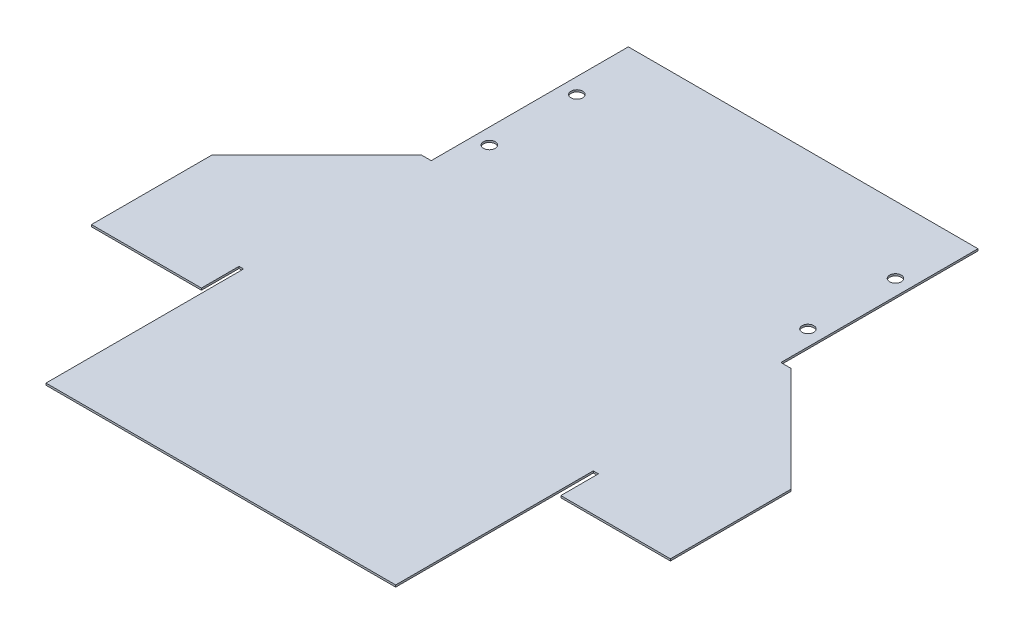
ISO-10303-21;
HEADER;
FILE_DESCRIPTION(('STEP AP214'),'2;1');
FILE_NAME('part.step','',(''),(''),'','','');
FILE_SCHEMA(('AUTOMOTIVE_DESIGN { 1 0 10303 214 1 1 1 1 }'));
ENDSEC;
DATA;
#1=APPLICATION_CONTEXT('core data for automotive mechanical design processes');
#2=APPLICATION_PROTOCOL_DEFINITION('international standard','automotive_design',2000,#1);
#3=PRODUCT_CONTEXT('',#1,'mechanical');
#4=PRODUCT('Part','Part','',(#3));
#5=PRODUCT_RELATED_PRODUCT_CATEGORY('part','',(#4));
#6=PRODUCT_DEFINITION_FORMATION('','',#4);
#7=PRODUCT_DEFINITION_CONTEXT('part definition',#1,'design');
#8=PRODUCT_DEFINITION('design','',#6,#7);
#9=PRODUCT_DEFINITION_SHAPE('','',#8);
#10=(LENGTH_UNIT() NAMED_UNIT(*) SI_UNIT(.MILLI.,.METRE.));
#11=(NAMED_UNIT(*) PLANE_ANGLE_UNIT() SI_UNIT($,.RADIAN.));
#12=(NAMED_UNIT(*) SI_UNIT($,.STERADIAN.) SOLID_ANGLE_UNIT());
#13=UNCERTAINTY_MEASURE_WITH_UNIT(LENGTH_MEASURE(1.E-05),#10,'distance_accuracy_value','');
#14=(GEOMETRIC_REPRESENTATION_CONTEXT(3) GLOBAL_UNCERTAINTY_ASSIGNED_CONTEXT((#13)) GLOBAL_UNIT_ASSIGNED_CONTEXT((#10,
#11,#12)) REPRESENTATION_CONTEXT('',''));
#15=CARTESIAN_POINT('',(0.,0.,0.));
#16=DIRECTION('',(0.,0.,1.));
#17=DIRECTION('',(1.,0.,0.));
#18=AXIS2_PLACEMENT_3D('',#15,#16,#17);
#19=CARTESIAN_POINT('',(0.,-0.500000000000087,33.4950679290022));
#20=DIRECTION('',(0.,-1.,0.));
#21=DIRECTION('',(0.,0.,-1.));
#22=AXIS2_PLACEMENT_3D('',#19,#20,#21);
#23=PLANE('',#22);
#24=DIRECTION('',(0.,0.,-1.));
#25=VECTOR('',#24,1.);
#26=CARTESIAN_POINT('',(45.,-0.499999999999993,19.6764661526356));
#27=LINE('',#26,#25);
#28=CARTESIAN_POINT('',(45.,-0.500000000000066,-30.174835060175));
#29=VERTEX_POINT('',#28);
#30=CARTESIAN_POINT('',(45.,-0.499999999999993,20.5600390864577));
#31=VERTEX_POINT('',#30);
#32=EDGE_CURVE('E314',#29,#31,#27,.F.);
#33=ORIENTED_EDGE('',*,*,#32,.T.);
#34=DIRECTION('',(1.,0.,0.));
#35=VECTOR('',#34,1.);
#36=CARTESIAN_POINT('',(45.6675884388878,-0.499999999999992,20.5600390864577));
#37=LINE('',#36,#35);
#38=CARTESIAN_POINT('',(47.6493904401487,-0.500000000000004,20.5600390864577));
#39=VERTEX_POINT('',#38);
#40=EDGE_CURVE('E440',#31,#39,#37,.T.);
#41=ORIENTED_EDGE('',*,*,#40,.T.);
#42=DIRECTION('',(-0.707106781186544,0.,-0.707106781186551));
#43=VECTOR('',#42,1.);
#44=CARTESIAN_POINT('',(60.2308658920997,-0.500000000000172,33.1415145384088));
#45=LINE('',#44,#43);
#46=CARTESIAN_POINT('',(74.5351768777756,-0.500000000000365,47.4458255240849));
#47=VERTEX_POINT('',#46);
#48=EDGE_CURVE('E419',#47,#39,#45,.T.);
#49=ORIENTED_EDGE('',*,*,#48,.F.);
#50=DIRECTION('',(0.,0.,1.));
#51=VECTOR('',#50,1.);
#52=CARTESIAN_POINT('',(74.5351768777751,-0.500000000001402,114.131029550367));
#53=LINE('',#52,#51);
#54=CARTESIAN_POINT('',(74.5351768777755,-0.500000000000916,78.5310295503674));
#55=VERTEX_POINT('',#54);
#56=EDGE_CURVE('E432',#47,#55,#53,.T.);
#57=ORIENTED_EDGE('',*,*,#56,.T.);
#58=DIRECTION('',(-1.,0.,0.));
#59=VECTOR('',#58,1.);
#60=CARTESIAN_POINT('',(59.8773125015063,-0.500000000000814,78.5310295503673));
#61=LINE('',#60,#59);
#62=CARTESIAN_POINT('',(46.3351768777755,-0.500000000000703,78.5310295503671));
#63=VERTEX_POINT('',#62);
#64=EDGE_CURVE('E430',#55,#63,#61,.T.);
#65=ORIENTED_EDGE('',*,*,#64,.T.);
#66=DIRECTION('',(0.,0.,-1.));
#67=VECTOR('',#66,1.);
#68=CARTESIAN_POINT('',(46.3351768777751,-0.500000000001208,114.131029550367));
#69=LINE('',#68,#67);
#70=CARTESIAN_POINT('',(46.3351768777756,-0.5000000000005,68.8529323052712));
#71=VERTEX_POINT('',#70);
#72=EDGE_CURVE('E429',#63,#71,#69,.T.);
#73=ORIENTED_EDGE('',*,*,#72,.T.);
#74=DIRECTION('',(1.,0.,0.));
#75=VECTOR('',#74,1.);
#76=CARTESIAN_POINT('',(45.6675884388878,-0.50000000000032,68.8529323052712));
#77=LINE('',#76,#75);
#78=CARTESIAN_POINT('',(45.,-0.50000000000032,68.8529323052712));
#79=VERTEX_POINT('',#78);
#80=EDGE_CURVE('E442',#71,#79,#77,.F.);
#81=ORIENTED_EDGE('',*,*,#80,.T.);
#82=DIRECTION('',(0.,0.,-1.));
#83=VECTOR('',#82,1.);
#84=CARTESIAN_POINT('',(45.,-0.500000000000346,69.4419809278193));
#85=LINE('',#84,#83);
#86=CARTESIAN_POINT('',(45.,-0.500000000001145,119.709126795464));
#87=VERTEX_POINT('',#86);
#88=EDGE_CURVE('E361',#79,#87,#85,.F.);
#89=ORIENTED_EDGE('',*,*,#88,.T.);
#90=DIRECTION('',(1.,0.,0.));
#91=VECTOR('',#90,1.);
#92=CARTESIAN_POINT('',(45.,-0.500000000001145,119.709126795464));
#93=LINE('',#92,#91);
#94=CARTESIAN_POINT('',(-45.,-0.500000000001159,119.709126795464));
#95=VERTEX_POINT('',#94);
#96=EDGE_CURVE('E344',#95,#87,#93,.T.);
#97=ORIENTED_EDGE('',*,*,#96,.F.);
#98=DIRECTION('',(0.,0.,-1.));
#99=VECTOR('',#98,1.);
#100=CARTESIAN_POINT('',(-45.,-0.500000000000359,69.4419809278193));
#101=LINE('',#100,#99);
#102=CARTESIAN_POINT('',(-45.,-0.500000000000353,68.8529323052712));
#103=VERTEX_POINT('',#102);
#104=EDGE_CURVE('E363',#95,#103,#101,.T.);
#105=ORIENTED_EDGE('',*,*,#104,.T.);
#106=DIRECTION('',(1.,0.,0.));
#107=VECTOR('',#106,1.);
#108=CARTESIAN_POINT('',(-45.5890486225481,-0.500000000000339,68.8529323052712));
#109=LINE('',#108,#107);
#110=CARTESIAN_POINT('',(-46.1780972450961,-0.500000000000339,68.8529323052712));
#111=VERTEX_POINT('',#110);
#112=EDGE_CURVE('E405',#103,#111,#109,.F.);
#113=ORIENTED_EDGE('',*,*,#112,.T.);
#114=DIRECTION('',(0.,0.,1.));
#115=VECTOR('',#114,1.);
#116=CARTESIAN_POINT('',(-46.1780972450956,-0.500000000000979,114.031029550367));
#117=LINE('',#116,#115);
#118=CARTESIAN_POINT('',(-46.1780972450961,-0.500000000000479,78.5310295503673));
#119=VERTEX_POINT('',#118);
#120=EDGE_CURVE('E378',#111,#119,#117,.T.);
#121=ORIENTED_EDGE('',*,*,#120,.T.);
#122=DIRECTION('',(-1.,0.,0.));
#123=VECTOR('',#122,1.);
#124=CARTESIAN_POINT('',(-59.8202328688269,-0.500000000000582,78.5310295503675));
#125=LINE('',#124,#123);
#126=CARTESIAN_POINT('',(-74.478097245096,-0.500000000000687,78.5310295503676));
#127=VERTEX_POINT('',#126);
#128=EDGE_CURVE('E375',#119,#127,#125,.T.);
#129=ORIENTED_EDGE('',*,*,#128,.T.);
#130=DIRECTION('',(0.,0.,1.));
#131=VECTOR('',#130,1.);
#132=CARTESIAN_POINT('',(-74.4780972450962,-0.500000000000535,68.8529323052713));
#133=LINE('',#132,#131);
#134=CARTESIAN_POINT('',(-74.4780972450962,-0.500000000000382,47.4458255240851));
#135=VERTEX_POINT('',#134);
#136=EDGE_CURVE('E385',#135,#127,#133,.T.);
#137=ORIENTED_EDGE('',*,*,#136,.F.);
#138=DIRECTION('',(0.707106781186543,0.,-0.707106781186552));
#139=VECTOR('',#138,1.);
#140=CARTESIAN_POINT('',(-60.1737862594203,-0.500000000000188,33.141514538409));
#141=LINE('',#140,#139);
#142=CARTESIAN_POINT('',(-47.5923108074692,-0.500000000000006,20.5600390864578));
#143=VERTEX_POINT('',#142);
#144=EDGE_CURVE('E379',#143,#135,#141,.F.);
#145=ORIENTED_EDGE('',*,*,#144,.F.);
#146=DIRECTION('',(1.,0.,0.));
#147=VECTOR('',#146,1.);
#148=CARTESIAN_POINT('',(-45.5890486225481,-0.500000000000006,20.5600390864577));
#149=LINE('',#148,#147);
#150=CARTESIAN_POINT('',(-45.,-0.500000000000006,20.5600390864577));
#151=VERTEX_POINT('',#150);
#152=EDGE_CURVE('E402',#143,#151,#149,.T.);
#153=ORIENTED_EDGE('',*,*,#152,.T.);
#154=DIRECTION('',(0.,0.,-1.));
#155=VECTOR('',#154,1.);
#156=CARTESIAN_POINT('',(-45.,-0.499999999999993,19.6764661526356));
#157=LINE('',#156,#155);
#158=CARTESIAN_POINT('',(-45.,-0.500000000000066,-30.174835060175));
#159=VERTEX_POINT('',#158);
#160=EDGE_CURVE('E321',#151,#159,#157,.T.);
#161=ORIENTED_EDGE('',*,*,#160,.T.);
#162=DIRECTION('',(1.,0.,0.));
#163=VECTOR('',#162,1.);
#164=CARTESIAN_POINT('',(45.,-0.500000000000066,-30.174835060175));
#165=LINE('',#164,#163);
#166=EDGE_CURVE('E325',#159,#29,#165,.T.);
#167=ORIENTED_EDGE('',*,*,#166,.T.);
#168=EDGE_LOOP('',(#33,#41,#49,#57,#65,#73,#81,#89,#97,#105,#113,#121,#129,#137,#145,#153,#161,#167));
#169=FACE_BOUND('',#168,.T.);
#170=CARTESIAN_POINT('',(41.,-0.5,-12.9276695296638));
#171=DIRECTION('',(0.,-1.,0.));
#172=DIRECTION('',(0.,0.,1.));
#173=AXIS2_PLACEMENT_3D('',#170,#171,#172);
#174=CIRCLE('',#173,1.5);
#175=CARTESIAN_POINT('',(41.,-0.5,-11.4276695296638));
#176=VERTEX_POINT('',#175);
#177=EDGE_CURVE('E347',#176,#176,#174,.T.);
#178=ORIENTED_EDGE('',*,*,#177,.F.);
#179=EDGE_LOOP('',(#178));
#180=FACE_BOUND('',#179,.T.);
#181=CARTESIAN_POINT('',(-41.,-0.5,-12.9276695296638));
#182=DIRECTION('',(0.,-1.,0.));
#183=DIRECTION('',(0.,0.,-1.));
#184=AXIS2_PLACEMENT_3D('',#181,#182,#183);
#185=CIRCLE('',#184,1.5);
#186=CARTESIAN_POINT('',(-41.,-0.5,-14.4276695296638));
#187=VERTEX_POINT('',#186);
#188=EDGE_CURVE('E965',#187,#187,#185,.T.);
#189=ORIENTED_EDGE('',*,*,#188,.F.);
#190=EDGE_LOOP('',(#189));
#191=FACE_BOUND('',#190,.T.);
#192=CARTESIAN_POINT('',(41.,-0.5,9.59193788096968));
#193=DIRECTION('',(0.,-1.,0.));
#194=DIRECTION('',(0.,0.,1.));
#195=AXIS2_PLACEMENT_3D('',#192,#193,#194);
#196=CIRCLE('',#195,1.5);
#197=CARTESIAN_POINT('',(41.,-0.5,11.0919378809697));
#198=VERTEX_POINT('',#197);
#199=EDGE_CURVE('E973',#198,#198,#196,.T.);
#200=ORIENTED_EDGE('',*,*,#199,.F.);
#201=EDGE_LOOP('',(#200));
#202=FACE_BOUND('',#201,.T.);
#203=CARTESIAN_POINT('',(-41.,-0.5,9.59193788096968));
#204=DIRECTION('',(0.,-1.,0.));
#205=DIRECTION('',(0.,0.,-1.));
#206=AXIS2_PLACEMENT_3D('',#203,#204,#205);
#207=CIRCLE('',#206,1.5);
#208=CARTESIAN_POINT('',(-41.,-0.5,8.09193788096968));
#209=VERTEX_POINT('',#208);
#210=EDGE_CURVE('E979',#209,#209,#207,.T.);
#211=ORIENTED_EDGE('',*,*,#210,.F.);
#212=EDGE_LOOP('',(#211));
#213=FACE_BOUND('',#212,.T.);
#214=ADVANCED_FACE('F186',(#169,#180,#191,#202,#213),#23,.T.);
#215=CARTESIAN_POINT('',(0.,0.,0.));
#216=DIRECTION('',(0.,1.,0.));
#217=DIRECTION('',(0.,0.,1.));
#218=AXIS2_PLACEMENT_3D('',#215,#216,#217);
#219=PLANE('',#218);
#220=DIRECTION('',(0.,0.,-1.));
#221=VECTOR('',#220,1.);
#222=CARTESIAN_POINT('',(-45.,0.,19.6764661526356));
#223=LINE('',#222,#221);
#224=CARTESIAN_POINT('',(-45.,0.,20.5600390864577));
#225=VERTEX_POINT('',#224);
#226=CARTESIAN_POINT('',(-45.,0.,-30.174835060175));
#227=VERTEX_POINT('',#226);
#228=EDGE_CURVE('E322',#225,#227,#223,.T.);
#229=ORIENTED_EDGE('',*,*,#228,.F.);
#230=DIRECTION('',(1.,0.,0.));
#231=VECTOR('',#230,1.);
#232=CARTESIAN_POINT('',(-45.5890486225481,0.,20.5600390864577));
#233=LINE('',#232,#231);
#234=CARTESIAN_POINT('',(-47.5923108074692,0.,20.5600390864578));
#235=VERTEX_POINT('',#234);
#236=EDGE_CURVE('E211',#235,#225,#233,.T.);
#237=ORIENTED_EDGE('',*,*,#236,.F.);
#238=DIRECTION('',(-0.707106781186543,0.,0.707106781186552));
#239=VECTOR('',#238,1.);
#240=CARTESIAN_POINT('',(-60.1737862594203,-1.89084858881472E-13,33.141514538409));
#241=LINE('',#240,#239);
#242=CARTESIAN_POINT('',(-74.4780972450962,-3.90312782094782E-13,47.4458255240851));
#243=VERTEX_POINT('',#242);
#244=EDGE_CURVE('E371',#235,#243,#241,.T.);
#245=ORIENTED_EDGE('',*,*,#244,.T.);
#246=DIRECTION('',(0.,0.,1.));
#247=VECTOR('',#246,1.);
#248=CARTESIAN_POINT('',(-74.4780972450962,-5.39499001028787E-13,68.5310295503676));
#249=LINE('',#248,#247);
#250=CARTESIAN_POINT('',(-74.4780972450961,-6.78276879106932E-13,78.5310295503676));
#251=VERTEX_POINT('',#250);
#252=EDGE_CURVE('E395',#251,#243,#249,.F.);
#253=ORIENTED_EDGE('',*,*,#252,.F.);
#254=DIRECTION('',(1.,0.,0.));
#255=VECTOR('',#254,1.);
#256=CARTESIAN_POINT('',(-74.478097245096,-6.78276879106932E-13,78.5310295503676));
#257=LINE('',#256,#255);
#258=CARTESIAN_POINT('',(-46.1780972450961,-4.66640615037761E-13,78.5310295503673));
#259=VERTEX_POINT('',#258);
#260=EDGE_CURVE('E393',#259,#251,#257,.F.);
#261=ORIENTED_EDGE('',*,*,#260,.F.);
#262=DIRECTION('',(0.,0.,-1.));
#263=VECTOR('',#262,1.);
#264=CARTESIAN_POINT('',(-46.1780972450961,-4.77048955893622E-13,78.5310295503673));
#265=LINE('',#264,#263);
#266=CARTESIAN_POINT('',(-46.1780972450962,-1.85615411929518E-13,68.8529323052713));
#267=VERTEX_POINT('',#266);
#268=EDGE_CURVE('E381',#267,#259,#265,.F.);
#269=ORIENTED_EDGE('',*,*,#268,.F.);
#270=DIRECTION('',(1.,0.,0.));
#271=VECTOR('',#270,1.);
#272=CARTESIAN_POINT('',(-45.5890486225481,-3.43475248243408E-13,68.8529323052712));
#273=LINE('',#272,#271);
#274=CARTESIAN_POINT('',(-45.,-3.53883589099269E-13,68.8529323052712));
#275=VERTEX_POINT('',#274);
#276=EDGE_CURVE('E374',#275,#267,#273,.F.);
#277=ORIENTED_EDGE('',*,*,#276,.F.);
#278=DIRECTION('',(0.,0.,-1.));
#279=VECTOR('',#278,1.);
#280=CARTESIAN_POINT('',(-45.,-3.60822483003176E-13,69.4419809278193));
#281=LINE('',#280,#279);
#282=CARTESIAN_POINT('',(-45.,-1.17267306976032E-12,119.709126795464));
#283=VERTEX_POINT('',#282);
#284=EDGE_CURVE('E364',#283,#275,#281,.T.);
#285=ORIENTED_EDGE('',*,*,#284,.F.);
#286=DIRECTION('',(1.,0.,0.));
#287=VECTOR('',#286,1.);
#288=CARTESIAN_POINT('',(45.,-1.15879528195251E-12,119.709126795464));
#289=LINE('',#288,#287);
#290=CARTESIAN_POINT('',(45.,-1.15879528195251E-12,119.709126795464));
#291=VERTEX_POINT('',#290);
#292=EDGE_CURVE('E349',#283,#291,#289,.T.);
#293=ORIENTED_EDGE('',*,*,#292,.T.);
#294=DIRECTION('',(0.,0.,-1.));
#295=VECTOR('',#294,1.);
#296=CARTESIAN_POINT('',(45.,-3.46944695195361E-13,69.4419809278193));
#297=LINE('',#296,#295);
#298=CARTESIAN_POINT('',(45.,-3.40005801291454E-13,68.8529323052712));
#299=VERTEX_POINT('',#298);
#300=EDGE_CURVE('E352',#299,#291,#297,.F.);
#301=ORIENTED_EDGE('',*,*,#300,.F.);
#302=DIRECTION('',(1.,0.,0.));
#303=VECTOR('',#302,1.);
#304=CARTESIAN_POINT('',(45.6675884388878,-3.22658566531686E-13,68.8529323052712));
#305=LINE('',#304,#303);
#306=CARTESIAN_POINT('',(46.3351768777757,-3.3133218391157E-13,68.8529323052712));
#307=VERTEX_POINT('',#306);
#308=EDGE_CURVE('E443',#307,#299,#305,.F.);
#309=ORIENTED_EDGE('',*,*,#308,.F.);
#310=DIRECTION('',(0.,0.,1.));
#311=VECTOR('',#310,1.);
#312=CARTESIAN_POINT('',(46.3351768777756,-5.77662917500277E-13,68.5310295503671));
#313=LINE('',#312,#311);
#314=CARTESIAN_POINT('',(46.3351768777755,-7.14706072102445E-13,78.5310295503671));
#315=VERTEX_POINT('',#314);
#316=EDGE_CURVE('E425',#315,#307,#313,.F.);
#317=ORIENTED_EDGE('',*,*,#316,.F.);
#318=DIRECTION('',(1.,0.,0.));
#319=VECTOR('',#318,1.);
#320=CARTESIAN_POINT('',(46.3351768777755,-7.14706072102445E-13,78.5310295503671));
#321=LINE('',#320,#319);
#322=CARTESIAN_POINT('',(74.5351768777755,-9.10729824887824E-13,78.5310295503675));
#323=VERTEX_POINT('',#322);
#324=EDGE_CURVE('E404',#323,#315,#321,.F.);
#325=ORIENTED_EDGE('',*,*,#324,.F.);
#326=DIRECTION('',(0.,0.,-1.));
#327=VECTOR('',#326,1.);
#328=CARTESIAN_POINT('',(74.5351768777755,-9.08995101411847E-13,78.5310295503675));
#329=LINE('',#328,#327);
#330=CARTESIAN_POINT('',(74.5351768777756,-3.67761376907083E-13,47.4458255240849));
#331=VERTEX_POINT('',#330);
#332=EDGE_CURVE('E434',#331,#323,#329,.F.);
#333=ORIENTED_EDGE('',*,*,#332,.F.);
#334=DIRECTION('',(-0.707106781186544,0.,-0.707106781186551));
#335=VECTOR('',#334,1.);
#336=CARTESIAN_POINT('',(60.2308658920997,-1.73472347597681E-13,33.1415145384088));
#337=LINE('',#336,#335);
#338=CARTESIAN_POINT('',(47.6493904401487,0.,20.5600390864577));
#339=VERTEX_POINT('',#338);
#340=EDGE_CURVE('E412',#331,#339,#337,.T.);
#341=ORIENTED_EDGE('',*,*,#340,.T.);
#342=DIRECTION('',(1.,0.,0.));
#343=VECTOR('',#342,1.);
#344=CARTESIAN_POINT('',(45.6675884388878,0.,20.5600390864577));
#345=LINE('',#344,#343);
#346=CARTESIAN_POINT('',(45.,0.,20.5600390864577));
#347=VERTEX_POINT('',#346);
#348=EDGE_CURVE('E203',#347,#339,#345,.T.);
#349=ORIENTED_EDGE('',*,*,#348,.F.);
#350=DIRECTION('',(0.,0.,-1.));
#351=VECTOR('',#350,1.);
#352=CARTESIAN_POINT('',(45.,0.,19.6764661526356));
#353=LINE('',#352,#351);
#354=CARTESIAN_POINT('',(45.,0.,-30.174835060175));
#355=VERTEX_POINT('',#354);
#356=EDGE_CURVE('E345',#355,#347,#353,.F.);
#357=ORIENTED_EDGE('',*,*,#356,.F.);
#358=DIRECTION('',(1.,0.,0.));
#359=VECTOR('',#358,1.);
#360=CARTESIAN_POINT('',(45.,0.,-30.174835060175));
#361=LINE('',#360,#359);
#362=EDGE_CURVE('E336',#227,#355,#361,.T.);
#363=ORIENTED_EDGE('',*,*,#362,.F.);
#364=EDGE_LOOP('',(#229,#237,#245,#253,#261,#269,#277,#285,#293,#301,#309,#317,#325,#333,#341,
#349,#357,#363));
#365=FACE_BOUND('',#364,.T.);
#366=CARTESIAN_POINT('',(41.,0.,-12.9276695296638));
#367=DIRECTION('',(0.,1.,0.));
#368=DIRECTION('',(0.,0.,1.));
#369=AXIS2_PLACEMENT_3D('',#366,#367,#368);
#370=CIRCLE('',#369,1.5);
#371=CARTESIAN_POINT('',(41.,0.,-11.4276695296638));
#372=VERTEX_POINT('',#371);
#373=EDGE_CURVE('E961',#372,#372,#370,.T.);
#374=ORIENTED_EDGE('',*,*,#373,.F.);
#375=EDGE_LOOP('',(#374));
#376=FACE_BOUND('',#375,.T.);
#377=CARTESIAN_POINT('',(-41.,0.,-12.9276695296638));
#378=DIRECTION('',(0.,1.,0.));
#379=DIRECTION('',(0.,0.,1.));
#380=AXIS2_PLACEMENT_3D('',#377,#378,#379);
#381=CIRCLE('',#380,1.5);
#382=CARTESIAN_POINT('',(-41.,0.,-11.4276695296638));
#383=VERTEX_POINT('',#382);
#384=EDGE_CURVE('E970',#383,#383,#381,.T.);
#385=ORIENTED_EDGE('',*,*,#384,.F.);
#386=EDGE_LOOP('',(#385));
#387=FACE_BOUND('',#386,.T.);
#388=CARTESIAN_POINT('',(41.,0.,9.59193788096968));
#389=DIRECTION('',(0.,1.,0.));
#390=DIRECTION('',(0.,0.,1.));
#391=AXIS2_PLACEMENT_3D('',#388,#389,#390);
#392=CIRCLE('',#391,1.5);
#393=CARTESIAN_POINT('',(41.,0.,11.0919378809697));
#394=VERTEX_POINT('',#393);
#395=EDGE_CURVE('E976',#394,#394,#392,.T.);
#396=ORIENTED_EDGE('',*,*,#395,.F.);
#397=EDGE_LOOP('',(#396));
#398=FACE_BOUND('',#397,.T.);
#399=CARTESIAN_POINT('',(-41.,0.,9.59193788096968));
#400=DIRECTION('',(0.,1.,0.));
#401=DIRECTION('',(0.,0.,1.));
#402=AXIS2_PLACEMENT_3D('',#399,#400,#401);
#403=CIRCLE('',#402,1.5);
#404=CARTESIAN_POINT('',(-41.,0.,11.0919378809697));
#405=VERTEX_POINT('',#404);
#406=EDGE_CURVE('E331',#405,#405,#403,.T.);
#407=ORIENTED_EDGE('',*,*,#406,.F.);
#408=EDGE_LOOP('',(#407));
#409=FACE_BOUND('',#408,.T.);
#410=ADVANCED_FACE('F188',(#365,#376,#387,#398,#409),#219,.T.);
#411=CARTESIAN_POINT('',(45.6675884388878,-0.249999999999993,20.5600390864577));
#412=DIRECTION('',(0.,0.,-1.));
#413=DIRECTION('',(1.,0.,0.));
#414=AXIS2_PLACEMENT_3D('',#411,#412,#413);
#415=PLANE('',#414);
#416=DIRECTION('',(0.,-1.,0.));
#417=VECTOR('',#416,1.);
#418=CARTESIAN_POINT('',(45.,0.,20.5600390864577));
#419=LINE('',#418,#417);
#420=EDGE_CURVE('E13',#347,#31,#419,.T.);
#421=ORIENTED_EDGE('',*,*,#420,.F.);
#422=ORIENTED_EDGE('',*,*,#348,.T.);
#423=DIRECTION('',(0.,1.,0.));
#424=VECTOR('',#423,1.);
#425=CARTESIAN_POINT('',(47.6493904401487,0.,20.5600390864577));
#426=LINE('',#425,#424);
#427=EDGE_CURVE('E416',#339,#39,#426,.F.);
#428=ORIENTED_EDGE('',*,*,#427,.T.);
#429=ORIENTED_EDGE('',*,*,#40,.F.);
#430=EDGE_LOOP('',(#421,#422,#428,#429));
#431=FACE_BOUND('',#430,.T.);
#432=ADVANCED_FACE('F522',(#431),#415,.T.);
#433=CARTESIAN_POINT('',(45.6675884388878,-0.250000000000328,68.8529323052712));
#434=DIRECTION('',(0.,0.,-1.));
#435=DIRECTION('',(1.,0.,0.));
#436=AXIS2_PLACEMENT_3D('',#433,#434,#435);
#437=PLANE('',#436);
#438=ORIENTED_EDGE('',*,*,#308,.T.);
#439=DIRECTION('',(0.,-1.,0.));
#440=VECTOR('',#439,1.);
#441=CARTESIAN_POINT('',(45.,-3.40005801291454E-13,68.8529323052712));
#442=LINE('',#441,#440);
#443=EDGE_CURVE('E445',#299,#79,#442,.T.);
#444=ORIENTED_EDGE('',*,*,#443,.T.);
#445=ORIENTED_EDGE('',*,*,#80,.F.);
#446=DIRECTION('',(0.,-1.,0.));
#447=VECTOR('',#446,1.);
#448=CARTESIAN_POINT('',(46.3351768777756,-0.500000000000337,68.8529323052712));
#449=LINE('',#448,#447);
#450=EDGE_CURVE('E409',#307,#71,#449,.T.);
#451=ORIENTED_EDGE('',*,*,#450,.F.);
#452=EDGE_LOOP('',(#438,#444,#445,#451));
#453=FACE_BOUND('',#452,.T.);
#454=ADVANCED_FACE('F503',(#453),#437,.F.);
#455=CARTESIAN_POINT('',(46.3351768777755,-0.500000000000703,78.5310295503671));
#456=DIRECTION('',(0.,0.,-1.));
#457=DIRECTION('',(0.707106781186538,-0.707106781186557,0.));
#458=AXIS2_PLACEMENT_3D('',#455,#456,#457);
#459=PLANE('',#458);
#460=ORIENTED_EDGE('',*,*,#324,.T.);
#461=DIRECTION('',(0.,1.,0.));
#462=VECTOR('',#461,1.);
#463=CARTESIAN_POINT('',(46.3351768777755,-0.500000000000703,78.5310295503671));
#464=LINE('',#463,#462);
#465=EDGE_CURVE('E426',#63,#315,#464,.T.);
#466=ORIENTED_EDGE('',*,*,#465,.F.);
#467=ORIENTED_EDGE('',*,*,#64,.F.);
#468=DIRECTION('',(0.,1.,0.));
#469=VECTOR('',#468,1.);
#470=CARTESIAN_POINT('',(74.5351768777755,-0.500000000000913,78.5310295503675));
#471=LINE('',#470,#469);
#472=EDGE_CURVE('E436',#55,#323,#471,.T.);
#473=ORIENTED_EDGE('',*,*,#472,.T.);
#474=EDGE_LOOP('',(#460,#466,#467,#473));
#475=FACE_BOUND('',#474,.T.);
#476=ADVANCED_FACE('F511',(#475),#459,.F.);
#477=CARTESIAN_POINT('',(74.5351768777755,-0.500000000000911,78.5310295503675));
#478=DIRECTION('',(-1.,0.,0.));
#479=DIRECTION('',(0.,1.,0.));
#480=AXIS2_PLACEMENT_3D('',#477,#478,#479);
#481=PLANE('',#480);
#482=ORIENTED_EDGE('',*,*,#56,.F.);
#483=DIRECTION('',(0.,1.,0.));
#484=VECTOR('',#483,1.);
#485=CARTESIAN_POINT('',(74.5351768777756,-3.67761376907083E-13,47.4458255240849));
#486=LINE('',#485,#484);
#487=EDGE_CURVE('E422',#331,#47,#486,.F.);
#488=ORIENTED_EDGE('',*,*,#487,.F.);
#489=ORIENTED_EDGE('',*,*,#332,.T.);
#490=ORIENTED_EDGE('',*,*,#472,.F.);
#491=EDGE_LOOP('',(#482,#488,#489,#490));
#492=FACE_BOUND('',#491,.T.);
#493=ADVANCED_FACE('F520',(#492),#481,.F.);
#494=CARTESIAN_POINT('',(46.3351768777756,-0.50000000000058,68.5310295503671));
#495=DIRECTION('',(1.,0.,0.));
#496=DIRECTION('',(0.,-1.,0.));
#497=AXIS2_PLACEMENT_3D('',#494,#495,#496);
#498=PLANE('',#497);
#499=ORIENTED_EDGE('',*,*,#316,.T.);
#500=ORIENTED_EDGE('',*,*,#450,.T.);
#501=ORIENTED_EDGE('',*,*,#72,.F.);
#502=ORIENTED_EDGE('',*,*,#465,.T.);
#503=EDGE_LOOP('',(#499,#500,#501,#502));
#504=FACE_BOUND('',#503,.T.);
#505=ADVANCED_FACE('F507',(#504),#498,.F.);
#506=CARTESIAN_POINT('',(60.2308658920997,-1.73472347597681E-13,33.1415145384088));
#507=DIRECTION('',(-0.707106781186551,0.,0.707106781186544));
#508=DIRECTION('',(-0.707106781186544,0.,-0.707106781186551));
#509=AXIS2_PLACEMENT_3D('',#506,#507,#508);
#510=PLANE('',#509);
#511=ORIENTED_EDGE('',*,*,#427,.F.);
#512=ORIENTED_EDGE('',*,*,#340,.F.);
#513=ORIENTED_EDGE('',*,*,#487,.T.);
#514=ORIENTED_EDGE('',*,*,#48,.T.);
#515=EDGE_LOOP('',(#511,#512,#513,#514));
#516=FACE_BOUND('',#515,.T.);
#517=ADVANCED_FACE('F518',(#516),#510,.F.);
#518=CARTESIAN_POINT('',(-45.5890486225481,-0.250000000000342,68.8529323052712));
#519=DIRECTION('',(0.,0.,-1.));
#520=DIRECTION('',(1.,0.,0.));
#521=AXIS2_PLACEMENT_3D('',#518,#519,#520);
#522=PLANE('',#521);
#523=DIRECTION('',(0.,-1.,0.));
#524=VECTOR('',#523,1.);
#525=CARTESIAN_POINT('',(-45.,-3.53883589099269E-13,68.8529323052712));
#526=LINE('',#525,#524);
#527=EDGE_CURVE('E452',#275,#103,#526,.T.);
#528=ORIENTED_EDGE('',*,*,#527,.F.);
#529=ORIENTED_EDGE('',*,*,#276,.T.);
#530=DIRECTION('',(0.,-1.,0.));
#531=VECTOR('',#530,1.);
#532=CARTESIAN_POINT('',(-46.1780972450962,-3.2612801348364E-13,68.8529323052713));
#533=LINE('',#532,#531);
#534=EDGE_CURVE('E367',#267,#111,#533,.T.);
#535=ORIENTED_EDGE('',*,*,#534,.T.);
#536=ORIENTED_EDGE('',*,*,#112,.F.);
#537=EDGE_LOOP('',(#528,#529,#535,#536));
#538=FACE_BOUND('',#537,.T.);
#539=ADVANCED_FACE('F484',(#538),#522,.F.);
#540=CARTESIAN_POINT('',(-45.5890486225481,-0.250000000000005,20.5600390864577));
#541=DIRECTION('',(0.,0.,-1.));
#542=DIRECTION('',(1.,0.,0.));
#543=AXIS2_PLACEMENT_3D('',#540,#541,#542);
#544=PLANE('',#543);
#545=ORIENTED_EDGE('',*,*,#236,.T.);
#546=DIRECTION('',(0.,-1.,0.));
#547=VECTOR('',#546,1.);
#548=CARTESIAN_POINT('',(-45.,0.,20.5600390864577));
#549=LINE('',#548,#547);
#550=EDGE_CURVE('E195',#225,#151,#549,.T.);
#551=ORIENTED_EDGE('',*,*,#550,.T.);
#552=ORIENTED_EDGE('',*,*,#152,.F.);
#553=DIRECTION('',(0.,1.,0.));
#554=VECTOR('',#553,1.);
#555=CARTESIAN_POINT('',(-47.5923108074692,0.,20.5600390864578));
#556=LINE('',#555,#554);
#557=EDGE_CURVE('E382',#235,#143,#556,.F.);
#558=ORIENTED_EDGE('',*,*,#557,.F.);
#559=EDGE_LOOP('',(#545,#551,#552,#558));
#560=FACE_BOUND('',#559,.T.);
#561=ADVANCED_FACE('F525',(#560),#544,.T.);
#562=CARTESIAN_POINT('',(-74.4780972450962,-0.500000000000538,68.5310295503676));
#563=DIRECTION('',(1.,0.,0.));
#564=DIRECTION('',(0.,1.,0.));
#565=AXIS2_PLACEMENT_3D('',#562,#563,#564);
#566=PLANE('',#565);
#567=ORIENTED_EDGE('',*,*,#252,.T.);
#568=DIRECTION('',(0.,1.,0.));
#569=VECTOR('',#568,1.);
#570=CARTESIAN_POINT('',(-74.4780972450962,-3.90312782094782E-13,47.4458255240851));
#571=LINE('',#570,#569);
#572=EDGE_CURVE('E387',#243,#135,#571,.F.);
#573=ORIENTED_EDGE('',*,*,#572,.T.);
#574=ORIENTED_EDGE('',*,*,#136,.T.);
#575=DIRECTION('',(0.,1.,0.));
#576=VECTOR('',#575,1.);
#577=CARTESIAN_POINT('',(-74.478097245096,-0.500000000000687,78.5310295503676));
#578=LINE('',#577,#576);
#579=EDGE_CURVE('E397',#127,#251,#578,.T.);
#580=ORIENTED_EDGE('',*,*,#579,.T.);
#581=EDGE_LOOP('',(#567,#573,#574,#580));
#582=FACE_BOUND('',#581,.T.);
#583=ADVANCED_FACE('F477',(#582),#566,.F.);
#584=CARTESIAN_POINT('',(-74.478097245096,-0.500000000000687,78.5310295503676));
#585=DIRECTION('',(0.,0.,-1.));
#586=DIRECTION('',(-0.707106781186556,0.707106781186539,0.));
#587=AXIS2_PLACEMENT_3D('',#584,#585,#586);
#588=PLANE('',#587);
#589=ORIENTED_EDGE('',*,*,#260,.T.);
#590=ORIENTED_EDGE('',*,*,#579,.F.);
#591=ORIENTED_EDGE('',*,*,#128,.F.);
#592=DIRECTION('',(0.,1.,0.));
#593=VECTOR('',#592,1.);
#594=CARTESIAN_POINT('',(-46.178097245096,-0.500000000000474,78.5310295503673));
#595=LINE('',#594,#593);
#596=EDGE_CURVE('E390',#119,#259,#595,.T.);
#597=ORIENTED_EDGE('',*,*,#596,.T.);
#598=EDGE_LOOP('',(#589,#590,#591,#597));
#599=FACE_BOUND('',#598,.T.);
#600=ADVANCED_FACE('F469',(#599),#588,.F.);
#601=CARTESIAN_POINT('',(-60.1737862594203,-1.89084858881472E-13,33.141514538409));
#602=DIRECTION('',(0.707106781186552,0.,0.707106781186544));
#603=DIRECTION('',(-0.707106781186543,0.,0.707106781186552));
#604=AXIS2_PLACEMENT_3D('',#601,#602,#603);
#605=PLANE('',#604);
#606=ORIENTED_EDGE('',*,*,#572,.F.);
#607=ORIENTED_EDGE('',*,*,#244,.F.);
#608=ORIENTED_EDGE('',*,*,#557,.T.);
#609=ORIENTED_EDGE('',*,*,#144,.T.);
#610=EDGE_LOOP('',(#606,#607,#608,#609));
#611=FACE_BOUND('',#610,.T.);
#612=ADVANCED_FACE('F480',(#611),#605,.F.);
#613=CARTESIAN_POINT('',(-46.1780972450961,-0.500000000000472,78.5310295503673));
#614=DIRECTION('',(-1.,0.,0.));
#615=DIRECTION('',(0.,-1.,0.));
#616=AXIS2_PLACEMENT_3D('',#613,#614,#615);
#617=PLANE('',#616);
#618=ORIENTED_EDGE('',*,*,#120,.F.);
#619=ORIENTED_EDGE('',*,*,#534,.F.);
#620=ORIENTED_EDGE('',*,*,#268,.T.);
#621=ORIENTED_EDGE('',*,*,#596,.F.);
#622=EDGE_LOOP('',(#618,#619,#620,#621));
#623=FACE_BOUND('',#622,.T.);
#624=ADVANCED_FACE('F465',(#623),#617,.F.);
#625=CARTESIAN_POINT('',(45.,-0.250000000000347,69.4419809278193));
#626=DIRECTION('',(-1.,0.,0.));
#627=DIRECTION('',(0.,0.,-1.));
#628=AXIS2_PLACEMENT_3D('',#625,#626,#627);
#629=PLANE('',#628);
#630=ORIENTED_EDGE('',*,*,#443,.F.);
#631=ORIENTED_EDGE('',*,*,#300,.T.);
#632=DIRECTION('',(0.,1.,0.));
#633=VECTOR('',#632,1.);
#634=CARTESIAN_POINT('',(45.,-0.500000000001145,119.709126795464));
#635=LINE('',#634,#633);
#636=EDGE_CURVE('E356',#87,#291,#635,.T.);
#637=ORIENTED_EDGE('',*,*,#636,.F.);
#638=ORIENTED_EDGE('',*,*,#88,.F.);
#639=EDGE_LOOP('',(#630,#631,#637,#638));
#640=FACE_BOUND('',#639,.T.);
#641=ADVANCED_FACE('F497',(#640),#629,.F.);
#642=CARTESIAN_POINT('',(-45.,-0.250000000000361,69.4419809278193));
#643=DIRECTION('',(-1.,0.,0.));
#644=DIRECTION('',(0.,0.,-1.));
#645=AXIS2_PLACEMENT_3D('',#642,#643,#644);
#646=PLANE('',#645);
#647=ORIENTED_EDGE('',*,*,#284,.T.);
#648=ORIENTED_EDGE('',*,*,#527,.T.);
#649=ORIENTED_EDGE('',*,*,#104,.F.);
#650=DIRECTION('',(0.,1.,0.));
#651=VECTOR('',#650,1.);
#652=CARTESIAN_POINT('',(-45.,-0.500000000001159,119.709126795464));
#653=LINE('',#652,#651);
#654=EDGE_CURVE('E353',#95,#283,#653,.T.);
#655=ORIENTED_EDGE('',*,*,#654,.T.);
#656=EDGE_LOOP('',(#647,#648,#649,#655));
#657=FACE_BOUND('',#656,.T.);
#658=ADVANCED_FACE('F489',(#657),#646,.T.);
#659=CARTESIAN_POINT('',(45.,-0.500000000001145,119.709126795464));
#660=DIRECTION('',(0.,0.,1.));
#661=DIRECTION('',(0.,-1.,0.));
#662=AXIS2_PLACEMENT_3D('',#659,#660,#661);
#663=PLANE('',#662);
#664=ORIENTED_EDGE('',*,*,#292,.F.);
#665=ORIENTED_EDGE('',*,*,#654,.F.);
#666=ORIENTED_EDGE('',*,*,#96,.T.);
#667=ORIENTED_EDGE('',*,*,#636,.T.);
#668=EDGE_LOOP('',(#664,#665,#666,#667));
#669=FACE_BOUND('',#668,.T.);
#670=ADVANCED_FACE('F492',(#669),#663,.T.);
#671=CARTESIAN_POINT('',(45.,-0.249999999999993,19.6764661526356));
#672=DIRECTION('',(-1.,0.,0.));
#673=DIRECTION('',(0.,0.,-1.));
#674=AXIS2_PLACEMENT_3D('',#671,#672,#673);
#675=PLANE('',#674);
#676=ORIENTED_EDGE('',*,*,#32,.F.);
#677=DIRECTION('',(0.,1.,0.));
#678=VECTOR('',#677,1.);
#679=CARTESIAN_POINT('',(45.,-0.500000000000066,-30.174835060175));
#680=LINE('',#679,#678);
#681=EDGE_CURVE('E319',#29,#355,#680,.T.);
#682=ORIENTED_EDGE('',*,*,#681,.T.);
#683=ORIENTED_EDGE('',*,*,#356,.T.);
#684=ORIENTED_EDGE('',*,*,#420,.T.);
#685=EDGE_LOOP('',(#676,#682,#683,#684));
#686=FACE_BOUND('',#685,.T.);
#687=ADVANCED_FACE('F316',(#686),#675,.F.);
#688=CARTESIAN_POINT('',(-45.,-0.249999999999993,19.6764661526356));
#689=DIRECTION('',(-1.,0.,0.));
#690=DIRECTION('',(0.,0.,-1.));
#691=AXIS2_PLACEMENT_3D('',#688,#689,#690);
#692=PLANE('',#691);
#693=ORIENTED_EDGE('',*,*,#228,.T.);
#694=DIRECTION('',(0.,1.,0.));
#695=VECTOR('',#694,1.);
#696=CARTESIAN_POINT('',(-45.,-0.500000000000066,-30.174835060175));
#697=LINE('',#696,#695);
#698=EDGE_CURVE('E337',#159,#227,#697,.T.);
#699=ORIENTED_EDGE('',*,*,#698,.F.);
#700=ORIENTED_EDGE('',*,*,#160,.F.);
#701=ORIENTED_EDGE('',*,*,#550,.F.);
#702=EDGE_LOOP('',(#693,#699,#700,#701));
#703=FACE_BOUND('',#702,.T.);
#704=ADVANCED_FACE('F524',(#703),#692,.T.);
#705=CARTESIAN_POINT('',(45.,-0.500000000000066,-30.174835060175));
#706=DIRECTION('',(0.,0.,1.));
#707=DIRECTION('',(0.,-1.,0.));
#708=AXIS2_PLACEMENT_3D('',#705,#706,#707);
#709=PLANE('',#708);
#710=ORIENTED_EDGE('',*,*,#362,.T.);
#711=ORIENTED_EDGE('',*,*,#681,.F.);
#712=ORIENTED_EDGE('',*,*,#166,.F.);
#713=ORIENTED_EDGE('',*,*,#698,.T.);
#714=EDGE_LOOP('',(#710,#711,#712,#713));
#715=FACE_BOUND('',#714,.T.);
#716=ADVANCED_FACE('F334',(#715),#709,.F.);
#717=CARTESIAN_POINT('',(-41.,4.5,9.59193788096968));
#718=DIRECTION('',(0.,-1.,0.));
#719=DIRECTION('',(0.,0.,-1.));
#720=AXIS2_PLACEMENT_3D('',#717,#718,#719);
#721=CYLINDRICAL_SURFACE('',#720,1.5);
#722=ORIENTED_EDGE('',*,*,#406,.T.);
#723=EDGE_LOOP('',(#722));
#724=FACE_BOUND('',#723,.T.);
#725=ORIENTED_EDGE('',*,*,#210,.T.);
#726=EDGE_LOOP('',(#725));
#727=FACE_BOUND('',#726,.T.);
#728=ADVANCED_FACE('F670',(#724,#727),#721,.F.);
#729=CARTESIAN_POINT('',(41.,4.5,9.59193788096968));
#730=DIRECTION('',(0.,-1.,0.));
#731=DIRECTION('',(0.,0.,-1.));
#732=AXIS2_PLACEMENT_3D('',#729,#730,#731);
#733=CYLINDRICAL_SURFACE('',#732,1.5);
#734=ORIENTED_EDGE('',*,*,#395,.T.);
#735=EDGE_LOOP('',(#734));
#736=FACE_BOUND('',#735,.T.);
#737=ORIENTED_EDGE('',*,*,#199,.T.);
#738=EDGE_LOOP('',(#737));
#739=FACE_BOUND('',#738,.T.);
#740=ADVANCED_FACE('F681',(#736,#739),#733,.F.);
#741=CARTESIAN_POINT('',(-41.,4.5,-12.9276695296638));
#742=DIRECTION('',(0.,-1.,0.));
#743=DIRECTION('',(0.,0.,-1.));
#744=AXIS2_PLACEMENT_3D('',#741,#742,#743);
#745=CYLINDRICAL_SURFACE('',#744,1.5);
#746=ORIENTED_EDGE('',*,*,#384,.T.);
#747=EDGE_LOOP('',(#746));
#748=FACE_BOUND('',#747,.T.);
#749=ORIENTED_EDGE('',*,*,#188,.T.);
#750=EDGE_LOOP('',(#749));
#751=FACE_BOUND('',#750,.T.);
#752=ADVANCED_FACE('F692',(#748,#751),#745,.F.);
#753=CARTESIAN_POINT('',(41.,4.5,-12.9276695296638));
#754=DIRECTION('',(0.,-1.,0.));
#755=DIRECTION('',(0.,0.,-1.));
#756=AXIS2_PLACEMENT_3D('',#753,#754,#755);
#757=CYLINDRICAL_SURFACE('',#756,1.5);
#758=ORIENTED_EDGE('',*,*,#373,.T.);
#759=EDGE_LOOP('',(#758));
#760=FACE_BOUND('',#759,.T.);
#761=ORIENTED_EDGE('',*,*,#177,.T.);
#762=EDGE_LOOP('',(#761));
#763=FACE_BOUND('',#762,.T.);
#764=ADVANCED_FACE('F703',(#760,#763),#757,.F.);
#765=CLOSED_SHELL('',(#214,#410,#432,#454,#476,#493,#505,#517,#539,#561,#583,#600,#612,#624,
#641,#658,#670,#687,#704,#716,#728,#740,#752,#764));
#766=MANIFOLD_SOLID_BREP('B2',#765);
#767=ADVANCED_BREP_SHAPE_REPRESENTATION('',(#18,#766),#14);
#768=SHAPE_DEFINITION_REPRESENTATION(#9,#767);
ENDSEC;
END-ISO-10303-21;
